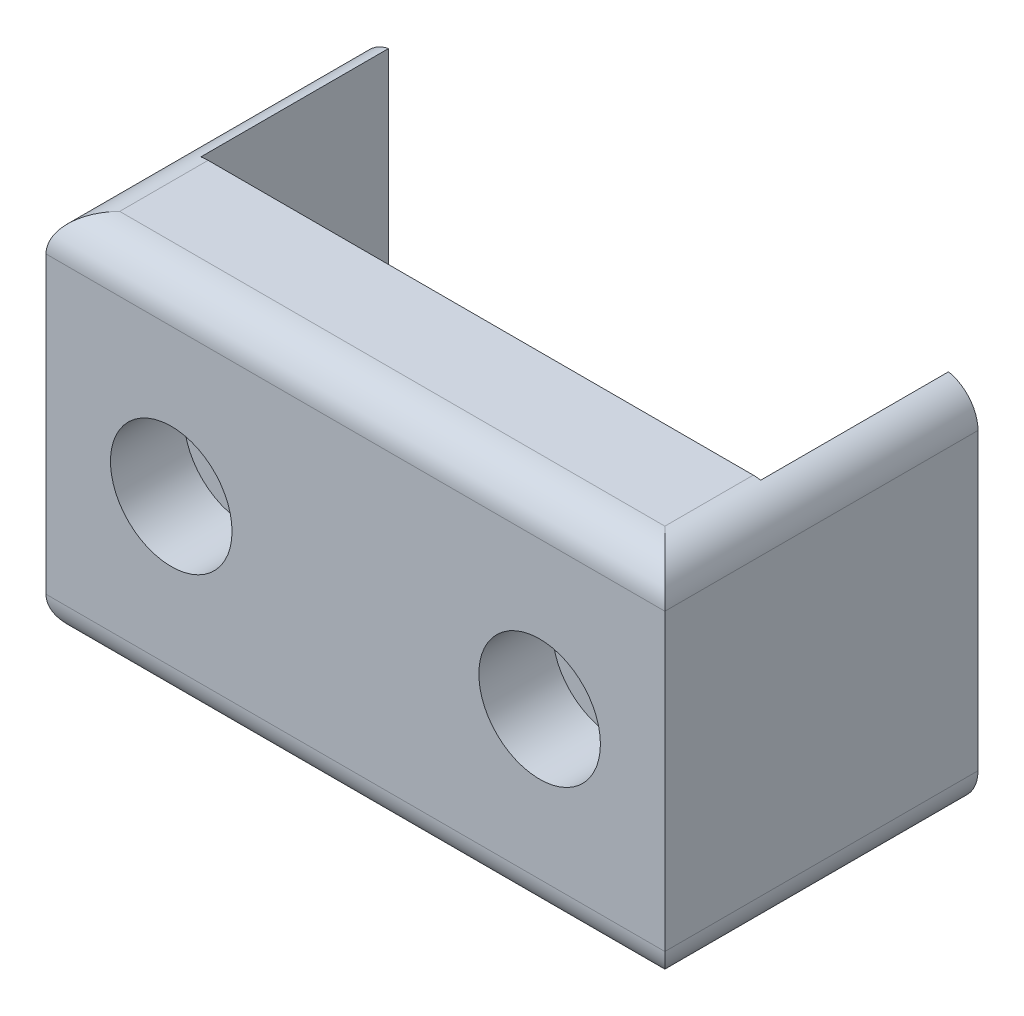
ISO-10303-21;
HEADER;
FILE_DESCRIPTION(('STEP AP214'),'2;1');
FILE_NAME('part.step','',(''),(''),'','','');
FILE_SCHEMA(('AUTOMOTIVE_DESIGN { 1 0 10303 214 1 1 1 1 }'));
ENDSEC;
DATA;
#1=APPLICATION_CONTEXT('core data for automotive mechanical design processes');
#2=APPLICATION_PROTOCOL_DEFINITION('international standard','automotive_design',2000,#1);
#3=PRODUCT_CONTEXT('',#1,'mechanical');
#4=PRODUCT('Part','Part','',(#3));
#5=PRODUCT_RELATED_PRODUCT_CATEGORY('part','',(#4));
#6=PRODUCT_DEFINITION_FORMATION('','',#4);
#7=PRODUCT_DEFINITION_CONTEXT('part definition',#1,'design');
#8=PRODUCT_DEFINITION('design','',#6,#7);
#9=PRODUCT_DEFINITION_SHAPE('','',#8);
#10=(LENGTH_UNIT() NAMED_UNIT(*) SI_UNIT(.MILLI.,.METRE.));
#11=(NAMED_UNIT(*) PLANE_ANGLE_UNIT() SI_UNIT($,.RADIAN.));
#12=(NAMED_UNIT(*) SI_UNIT($,.STERADIAN.) SOLID_ANGLE_UNIT());
#13=UNCERTAINTY_MEASURE_WITH_UNIT(LENGTH_MEASURE(1.E-05),#10,'distance_accuracy_value','');
#14=(GEOMETRIC_REPRESENTATION_CONTEXT(3) GLOBAL_UNCERTAINTY_ASSIGNED_CONTEXT((#13)) GLOBAL_UNIT_ASSIGNED_CONTEXT((#10,
#11,#12)) REPRESENTATION_CONTEXT('',''));
#15=CARTESIAN_POINT('',(0.,0.,0.));
#16=DIRECTION('',(0.,0.,1.));
#17=DIRECTION('',(1.,0.,0.));
#18=AXIS2_PLACEMENT_3D('',#15,#16,#17);
#19=CARTESIAN_POINT('',(12.7,12.7,0.));
#20=DIRECTION('',(0.,0.,1.));
#21=DIRECTION('',(1.,0.,0.));
#22=AXIS2_PLACEMENT_3D('',#19,#20,#21);
#23=CYLINDRICAL_SURFACE('',#22,2.54);
#24=CARTESIAN_POINT('',(12.7,12.7,12.954));
#25=DIRECTION('',(0.,0.,-1.));
#26=DIRECTION('',(-1.,0.,0.));
#27=AXIS2_PLACEMENT_3D('',#24,#25,#26);
#28=CIRCLE('',#27,2.54);
#29=CARTESIAN_POINT('',(10.16,12.7,12.954));
#30=VERTEX_POINT('',#29);
#31=EDGE_CURVE('E242',#30,#30,#28,.T.);
#32=ORIENTED_EDGE('',*,*,#31,.T.);
#33=EDGE_LOOP('',(#32));
#34=FACE_BOUND('',#33,.T.);
#35=CARTESIAN_POINT('',(12.7,12.7,16.51));
#36=DIRECTION('',(0.,0.,1.));
#37=DIRECTION('',(1.,0.,0.));
#38=AXIS2_PLACEMENT_3D('',#35,#36,#37);
#39=CIRCLE('',#38,2.54);
#40=CARTESIAN_POINT('',(15.24,12.7,16.51));
#41=VERTEX_POINT('',#40);
#42=EDGE_CURVE('E239',#41,#41,#39,.F.);
#43=ORIENTED_EDGE('',*,*,#42,.F.);
#44=EDGE_LOOP('',(#43));
#45=FACE_BOUND('',#44,.T.);
#46=ADVANCED_FACE('F39',(#34,#45),#23,.F.);
#47=CARTESIAN_POINT('',(-12.7,12.7,0.));
#48=DIRECTION('',(0.,0.,1.));
#49=DIRECTION('',(1.,0.,0.));
#50=AXIS2_PLACEMENT_3D('',#47,#48,#49);
#51=CYLINDRICAL_SURFACE('',#50,2.54);
#52=CARTESIAN_POINT('',(-12.7,12.7,12.954));
#53=DIRECTION('',(0.,0.,-1.));
#54=DIRECTION('',(-1.,0.,0.));
#55=AXIS2_PLACEMENT_3D('',#52,#53,#54);
#56=CIRCLE('',#55,2.54);
#57=CARTESIAN_POINT('',(-15.24,12.7,12.954));
#58=VERTEX_POINT('',#57);
#59=EDGE_CURVE('E273',#58,#58,#56,.T.);
#60=ORIENTED_EDGE('',*,*,#59,.T.);
#61=EDGE_LOOP('',(#60));
#62=FACE_BOUND('',#61,.T.);
#63=CARTESIAN_POINT('',(-12.7,12.7,16.51));
#64=DIRECTION('',(0.,0.,1.));
#65=DIRECTION('',(1.,0.,0.));
#66=AXIS2_PLACEMENT_3D('',#63,#64,#65);
#67=CIRCLE('',#66,2.54);
#68=CARTESIAN_POINT('',(-10.16,12.7,16.51));
#69=VERTEX_POINT('',#68);
#70=EDGE_CURVE('E236',#69,#69,#67,.F.);
#71=ORIENTED_EDGE('',*,*,#70,.F.);
#72=EDGE_LOOP('',(#71));
#73=FACE_BOUND('',#72,.T.);
#74=ADVANCED_FACE('F318',(#62,#73),#51,.F.);
#75=CARTESIAN_POINT('',(21.336,25.4,0.));
#76=DIRECTION('',(1.,0.,0.));
#77=DIRECTION('',(0.,0.,-1.));
#78=AXIS2_PLACEMENT_3D('',#75,#76,#77);
#79=PLANE('',#78);
#80=DIRECTION('',(0.,-1.,0.));
#81=VECTOR('',#80,1.);
#82=CARTESIAN_POINT('',(21.336,25.4,21.59));
#83=LINE('',#82,#81);
#84=CARTESIAN_POINT('',(21.336,22.86,21.59));
#85=VERTEX_POINT('',#84);
#86=CARTESIAN_POINT('',(21.336,2.54,21.59));
#87=VERTEX_POINT('',#86);
#88=EDGE_CURVE('E152',#85,#87,#83,.T.);
#89=ORIENTED_EDGE('',*,*,#88,.T.);
#90=DIRECTION('',(0.,0.,1.));
#91=VECTOR('',#90,1.);
#92=CARTESIAN_POINT('',(21.336,2.54,0.));
#93=LINE('',#92,#91);
#94=CARTESIAN_POINT('',(21.336,2.54,0.));
#95=VERTEX_POINT('',#94);
#96=EDGE_CURVE('E63',#87,#95,#93,.F.);
#97=ORIENTED_EDGE('',*,*,#96,.T.);
#98=DIRECTION('',(0.,-1.,0.));
#99=VECTOR('',#98,1.);
#100=CARTESIAN_POINT('',(21.336,25.4,0.));
#101=LINE('',#100,#99);
#102=CARTESIAN_POINT('',(21.336,22.86,0.));
#103=VERTEX_POINT('',#102);
#104=EDGE_CURVE('E229',#103,#95,#101,.T.);
#105=ORIENTED_EDGE('',*,*,#104,.F.);
#106=DIRECTION('',(0.,0.,1.));
#107=VECTOR('',#106,1.);
#108=CARTESIAN_POINT('',(21.336,22.86,0.));
#109=LINE('',#108,#107);
#110=EDGE_CURVE('E143',#103,#85,#109,.T.);
#111=ORIENTED_EDGE('',*,*,#110,.T.);
#112=EDGE_LOOP('',(#89,#97,#105,#111));
#113=FACE_BOUND('',#112,.T.);
#114=ADVANCED_FACE('F324',(#113),#79,.T.);
#115=CARTESIAN_POINT('',(0.,25.4,0.));
#116=DIRECTION('',(0.,0.,-1.));
#117=DIRECTION('',(-1.,0.,0.));
#118=AXIS2_PLACEMENT_3D('',#115,#116,#117);
#119=PLANE('',#118);
#120=ORIENTED_EDGE('',*,*,#104,.T.);
#121=CARTESIAN_POINT('',(18.796,2.54,0.));
#122=DIRECTION('',(0.,0.,-1.));
#123=DIRECTION('',(-1.,0.,0.));
#124=AXIS2_PLACEMENT_3D('',#121,#122,#123);
#125=CIRCLE('',#124,2.54);
#126=CARTESIAN_POINT('',(19.304,0.0513184213322936,0.));
#127=VERTEX_POINT('',#126);
#128=EDGE_CURVE('E48',#95,#127,#125,.T.);
#129=ORIENTED_EDGE('',*,*,#128,.T.);
#130=DIRECTION('',(0.,-1.,0.));
#131=VECTOR('',#130,1.);
#132=CARTESIAN_POINT('',(19.304,25.4,0.));
#133=LINE('',#132,#131);
#134=CARTESIAN_POINT('',(19.304,25.3486815786677,0.));
#135=VERTEX_POINT('',#134);
#136=EDGE_CURVE('E226',#135,#127,#133,.T.);
#137=ORIENTED_EDGE('',*,*,#136,.F.);
#138=CARTESIAN_POINT('',(18.796,22.86,0.));
#139=DIRECTION('',(0.,0.,-1.));
#140=DIRECTION('',(-1.,0.,0.));
#141=AXIS2_PLACEMENT_3D('',#138,#139,#140);
#142=CIRCLE('',#141,2.54);
#143=EDGE_CURVE('E176',#135,#103,#142,.T.);
#144=ORIENTED_EDGE('',*,*,#143,.T.);
#145=EDGE_LOOP('',(#120,#129,#137,#144));
#146=FACE_BOUND('',#145,.T.);
#147=ADVANCED_FACE('F339',(#146),#119,.T.);
#148=CARTESIAN_POINT('',(19.304,25.4,0.));
#149=DIRECTION('',(1.,0.,0.));
#150=DIRECTION('',(0.,0.,-1.));
#151=AXIS2_PLACEMENT_3D('',#148,#149,#150);
#152=PLANE('',#151);
#153=ORIENTED_EDGE('',*,*,#136,.T.);
#154=DIRECTION('',(0.,0.,-1.));
#155=VECTOR('',#154,1.);
#156=CARTESIAN_POINT('',(19.304,0.0513184213322923,0.));
#157=LINE('',#156,#155);
#158=CARTESIAN_POINT('',(19.304,0.0513184213322918,12.954));
#159=VERTEX_POINT('',#158);
#160=EDGE_CURVE('E11',#127,#159,#157,.F.);
#161=ORIENTED_EDGE('',*,*,#160,.T.);
#162=DIRECTION('',(0.,-1.,0.));
#163=VECTOR('',#162,1.);
#164=CARTESIAN_POINT('',(19.304,25.4,12.954));
#165=LINE('',#164,#163);
#166=CARTESIAN_POINT('',(19.304,25.3486815786677,12.954));
#167=VERTEX_POINT('',#166);
#168=EDGE_CURVE('E224',#167,#159,#165,.T.);
#169=ORIENTED_EDGE('',*,*,#168,.F.);
#170=DIRECTION('',(0.,0.,1.));
#171=VECTOR('',#170,1.);
#172=CARTESIAN_POINT('',(19.304,25.3486815786677,12.954));
#173=LINE('',#172,#171);
#174=EDGE_CURVE('E174',#167,#135,#173,.F.);
#175=ORIENTED_EDGE('',*,*,#174,.T.);
#176=EDGE_LOOP('',(#153,#161,#169,#175));
#177=FACE_BOUND('',#176,.T.);
#178=ADVANCED_FACE('F223',(#177),#152,.F.);
#179=CARTESIAN_POINT('',(0.,25.4,12.954));
#180=DIRECTION('',(0.,0.,-1.));
#181=DIRECTION('',(-1.,0.,0.));
#182=AXIS2_PLACEMENT_3D('',#179,#180,#181);
#183=PLANE('',#182);
#184=ORIENTED_EDGE('',*,*,#59,.F.);
#185=EDGE_LOOP('',(#184));
#186=FACE_BOUND('',#185,.T.);
#187=ORIENTED_EDGE('',*,*,#31,.F.);
#188=EDGE_LOOP('',(#187));
#189=FACE_BOUND('',#188,.T.);
#190=DIRECTION('',(1.,0.,0.));
#191=VECTOR('',#190,1.);
#192=CARTESIAN_POINT('',(0.,0.,12.954));
#193=LINE('',#192,#191);
#194=CARTESIAN_POINT('',(-18.796,0.,12.954));
#195=VERTEX_POINT('',#194);
#196=CARTESIAN_POINT('',(18.796,0.,12.954));
#197=VERTEX_POINT('',#196);
#198=EDGE_CURVE('E153',#195,#197,#193,.T.);
#199=ORIENTED_EDGE('',*,*,#198,.F.);
#200=CARTESIAN_POINT('',(-18.796,2.54,12.954));
#201=DIRECTION('',(0.,0.,-1.));
#202=DIRECTION('',(-1.,0.,0.));
#203=AXIS2_PLACEMENT_3D('',#200,#201,#202);
#204=CIRCLE('',#203,2.54);
#205=CARTESIAN_POINT('',(-19.304,0.0513184213322901,12.954));
#206=VERTEX_POINT('',#205);
#207=EDGE_CURVE('E196',#195,#206,#204,.T.);
#208=ORIENTED_EDGE('',*,*,#207,.T.);
#209=DIRECTION('',(0.,-1.,0.));
#210=VECTOR('',#209,1.);
#211=CARTESIAN_POINT('',(-19.304,25.4,12.954));
#212=LINE('',#211,#210);
#213=CARTESIAN_POINT('',(-19.304,25.3486815786677,12.954));
#214=VERTEX_POINT('',#213);
#215=EDGE_CURVE('E139',#214,#206,#212,.T.);
#216=ORIENTED_EDGE('',*,*,#215,.F.);
#217=CARTESIAN_POINT('',(-18.796,22.86,12.954));
#218=DIRECTION('',(0.,0.,-1.));
#219=DIRECTION('',(-1.,0.,0.));
#220=AXIS2_PLACEMENT_3D('',#217,#218,#219);
#221=CIRCLE('',#220,2.54);
#222=CARTESIAN_POINT('',(-18.796,25.4,12.954));
#223=VERTEX_POINT('',#222);
#224=EDGE_CURVE('E132',#214,#223,#221,.T.);
#225=ORIENTED_EDGE('',*,*,#224,.T.);
#226=DIRECTION('',(1.,0.,0.));
#227=VECTOR('',#226,1.);
#228=CARTESIAN_POINT('',(0.,25.4,12.954));
#229=LINE('',#228,#227);
#230=CARTESIAN_POINT('',(18.796,25.4,12.954));
#231=VERTEX_POINT('',#230);
#232=EDGE_CURVE('E136',#223,#231,#229,.T.);
#233=ORIENTED_EDGE('',*,*,#232,.T.);
#234=CARTESIAN_POINT('',(18.796,22.86,12.954));
#235=DIRECTION('',(0.,0.,-1.));
#236=DIRECTION('',(-1.,0.,0.));
#237=AXIS2_PLACEMENT_3D('',#234,#235,#236);
#238=CIRCLE('',#237,2.54);
#239=EDGE_CURVE('E144',#231,#167,#238,.T.);
#240=ORIENTED_EDGE('',*,*,#239,.T.);
#241=ORIENTED_EDGE('',*,*,#168,.T.);
#242=CARTESIAN_POINT('',(18.796,2.54,12.954));
#243=DIRECTION('',(0.,0.,-1.));
#244=DIRECTION('',(-1.,0.,0.));
#245=AXIS2_PLACEMENT_3D('',#242,#243,#244);
#246=CIRCLE('',#245,2.54);
#247=EDGE_CURVE('E194',#159,#197,#246,.T.);
#248=ORIENTED_EDGE('',*,*,#247,.T.);
#249=EDGE_LOOP('',(#199,#208,#216,#225,#233,#240,#241,#248));
#250=FACE_BOUND('',#249,.T.);
#251=ADVANCED_FACE('F135',(#186,#189,#250),#183,.T.);
#252=CARTESIAN_POINT('',(-19.304,25.4,0.));
#253=DIRECTION('',(1.,0.,0.));
#254=DIRECTION('',(0.,0.,-1.));
#255=AXIS2_PLACEMENT_3D('',#252,#253,#254);
#256=PLANE('',#255);
#257=ORIENTED_EDGE('',*,*,#215,.T.);
#258=DIRECTION('',(0.,0.,1.));
#259=VECTOR('',#258,1.);
#260=CARTESIAN_POINT('',(-19.304,0.0513184213322905,12.954));
#261=LINE('',#260,#259);
#262=CARTESIAN_POINT('',(-19.304,0.051318421332291,0.));
#263=VERTEX_POINT('',#262);
#264=EDGE_CURVE('E198',#206,#263,#261,.F.);
#265=ORIENTED_EDGE('',*,*,#264,.T.);
#266=DIRECTION('',(0.,-1.,0.));
#267=VECTOR('',#266,1.);
#268=CARTESIAN_POINT('',(-19.304,25.4,0.));
#269=LINE('',#268,#267);
#270=CARTESIAN_POINT('',(-19.304,25.3486815786677,0.));
#271=VERTEX_POINT('',#270);
#272=EDGE_CURVE('E231',#271,#263,#269,.T.);
#273=ORIENTED_EDGE('',*,*,#272,.F.);
#274=DIRECTION('',(0.,0.,-1.));
#275=VECTOR('',#274,1.);
#276=CARTESIAN_POINT('',(-19.304,25.3486815786677,0.));
#277=LINE('',#276,#275);
#278=EDGE_CURVE('E170',#271,#214,#277,.F.);
#279=ORIENTED_EDGE('',*,*,#278,.T.);
#280=EDGE_LOOP('',(#257,#265,#273,#279));
#281=FACE_BOUND('',#280,.T.);
#282=ADVANCED_FACE('F268',(#281),#256,.T.);
#283=ORIENTED_EDGE('',*,*,#272,.T.);
#284=CARTESIAN_POINT('',(-18.796,2.54,0.));
#285=DIRECTION('',(0.,0.,-1.));
#286=DIRECTION('',(-1.,0.,0.));
#287=AXIS2_PLACEMENT_3D('',#284,#285,#286);
#288=CIRCLE('',#287,2.54);
#289=CARTESIAN_POINT('',(-21.336,2.54,0.));
#290=VERTEX_POINT('',#289);
#291=EDGE_CURVE('E200',#263,#290,#288,.T.);
#292=ORIENTED_EDGE('',*,*,#291,.T.);
#293=DIRECTION('',(0.,-1.,0.));
#294=VECTOR('',#293,1.);
#295=CARTESIAN_POINT('',(-21.336,25.4,0.));
#296=LINE('',#295,#294);
#297=CARTESIAN_POINT('',(-21.336,22.86,0.));
#298=VERTEX_POINT('',#297);
#299=EDGE_CURVE('E260',#298,#290,#296,.T.);
#300=ORIENTED_EDGE('',*,*,#299,.F.);
#301=CARTESIAN_POINT('',(-18.796,22.86,0.));
#302=DIRECTION('',(0.,0.,-1.));
#303=DIRECTION('',(-1.,0.,0.));
#304=AXIS2_PLACEMENT_3D('',#301,#302,#303);
#305=CIRCLE('',#304,2.54);
#306=EDGE_CURVE('E163',#298,#271,#305,.T.);
#307=ORIENTED_EDGE('',*,*,#306,.T.);
#308=EDGE_LOOP('',(#283,#292,#300,#307));
#309=FACE_BOUND('',#308,.T.);
#310=ADVANCED_FACE('F265',(#309),#119,.T.);
#311=CARTESIAN_POINT('',(-21.336,25.4,0.));
#312=DIRECTION('',(1.,0.,0.));
#313=DIRECTION('',(0.,0.,-1.));
#314=AXIS2_PLACEMENT_3D('',#311,#312,#313);
#315=PLANE('',#314);
#316=ORIENTED_EDGE('',*,*,#299,.T.);
#317=DIRECTION('',(0.,0.,1.));
#318=VECTOR('',#317,1.);
#319=CARTESIAN_POINT('',(-21.336,2.54,0.));
#320=LINE('',#319,#318);
#321=CARTESIAN_POINT('',(-21.336,2.54,21.59));
#322=VERTEX_POINT('',#321);
#323=EDGE_CURVE('E180',#290,#322,#320,.T.);
#324=ORIENTED_EDGE('',*,*,#323,.T.);
#325=DIRECTION('',(0.,-1.,0.));
#326=VECTOR('',#325,1.);
#327=CARTESIAN_POINT('',(-21.336,25.4,21.59));
#328=LINE('',#327,#326);
#329=CARTESIAN_POINT('',(-21.336,22.86,21.59));
#330=VERTEX_POINT('',#329);
#331=EDGE_CURVE('E255',#330,#322,#328,.T.);
#332=ORIENTED_EDGE('',*,*,#331,.F.);
#333=DIRECTION('',(0.,0.,1.));
#334=VECTOR('',#333,1.);
#335=CARTESIAN_POINT('',(-21.336,22.86,0.));
#336=LINE('',#335,#334);
#337=EDGE_CURVE('E161',#330,#298,#336,.F.);
#338=ORIENTED_EDGE('',*,*,#337,.T.);
#339=EDGE_LOOP('',(#316,#324,#332,#338));
#340=FACE_BOUND('',#339,.T.);
#341=ADVANCED_FACE('F258',(#340),#315,.F.);
#342=CARTESIAN_POINT('',(0.,25.4,21.59));
#343=DIRECTION('',(0.,0.,-1.));
#344=DIRECTION('',(-1.,0.,0.));
#345=AXIS2_PLACEMENT_3D('',#342,#343,#344);
#346=PLANE('',#345);
#347=CARTESIAN_POINT('',(-12.7,12.7,21.59));
#348=DIRECTION('',(0.,0.,1.));
#349=DIRECTION('',(1.,0.,0.));
#350=AXIS2_PLACEMENT_3D('',#347,#348,#349);
#351=CIRCLE('',#350,4.191);
#352=CARTESIAN_POINT('',(-8.509,12.7,21.59));
#353=VERTEX_POINT('',#352);
#354=EDGE_CURVE('E284',#353,#353,#351,.T.);
#355=ORIENTED_EDGE('',*,*,#354,.F.);
#356=EDGE_LOOP('',(#355));
#357=FACE_BOUND('',#356,.T.);
#358=CARTESIAN_POINT('',(12.7,12.7,21.59));
#359=DIRECTION('',(0.,0.,1.));
#360=DIRECTION('',(1.,0.,0.));
#361=AXIS2_PLACEMENT_3D('',#358,#359,#360);
#362=CIRCLE('',#361,4.191);
#363=CARTESIAN_POINT('',(16.891,12.7,21.59));
#364=VERTEX_POINT('',#363);
#365=EDGE_CURVE('E281',#364,#364,#362,.T.);
#366=ORIENTED_EDGE('',*,*,#365,.F.);
#367=EDGE_LOOP('',(#366));
#368=FACE_BOUND('',#367,.T.);
#369=ORIENTED_EDGE('',*,*,#331,.T.);
#370=DIRECTION('',(1.,0.,0.));
#371=VECTOR('',#370,1.);
#372=CARTESIAN_POINT('',(0.,2.54,21.59));
#373=LINE('',#372,#371);
#374=EDGE_CURVE('E202',#322,#87,#373,.T.);
#375=ORIENTED_EDGE('',*,*,#374,.T.);
#376=ORIENTED_EDGE('',*,*,#88,.F.);
#377=DIRECTION('',(1.,0.,0.));
#378=VECTOR('',#377,1.);
#379=CARTESIAN_POINT('',(-21.336,22.86,21.59));
#380=LINE('',#379,#378);
#381=EDGE_CURVE('E178',#85,#330,#380,.F.);
#382=ORIENTED_EDGE('',*,*,#381,.T.);
#383=EDGE_LOOP('',(#369,#375,#376,#382));
#384=FACE_BOUND('',#383,.T.);
#385=ADVANCED_FACE('F254',(#357,#368,#384),#346,.F.);
#386=CARTESIAN_POINT('',(0.,25.4,0.));
#387=DIRECTION('',(0.,1.,0.));
#388=DIRECTION('',(0.,0.,1.));
#389=AXIS2_PLACEMENT_3D('',#386,#387,#388);
#390=PLANE('',#389);
#391=ORIENTED_EDGE('',*,*,#232,.F.);
#392=DIRECTION('',(0.,0.,1.));
#393=VECTOR('',#392,1.);
#394=CARTESIAN_POINT('',(-18.796,25.4,21.59));
#395=LINE('',#394,#393);
#396=CARTESIAN_POINT('',(-18.796,25.4,19.05));
#397=VERTEX_POINT('',#396);
#398=EDGE_CURVE('E149',#223,#397,#395,.T.);
#399=ORIENTED_EDGE('',*,*,#398,.T.);
#400=DIRECTION('',(1.,0.,0.));
#401=VECTOR('',#400,1.);
#402=CARTESIAN_POINT('',(21.336,25.4,19.05));
#403=LINE('',#402,#401);
#404=CARTESIAN_POINT('',(18.796,25.4,19.05));
#405=VERTEX_POINT('',#404);
#406=EDGE_CURVE('E165',#397,#405,#403,.T.);
#407=ORIENTED_EDGE('',*,*,#406,.T.);
#408=DIRECTION('',(0.,0.,1.));
#409=VECTOR('',#408,1.);
#410=CARTESIAN_POINT('',(18.796,25.4,0.));
#411=LINE('',#410,#409);
#412=EDGE_CURVE('E151',#405,#231,#411,.F.);
#413=ORIENTED_EDGE('',*,*,#412,.T.);
#414=EDGE_LOOP('',(#391,#399,#407,#413));
#415=FACE_BOUND('',#414,.T.);
#416=ADVANCED_FACE('F148',(#415),#390,.T.);
#417=CARTESIAN_POINT('',(0.,0.,0.));
#418=DIRECTION('',(0.,1.,0.));
#419=DIRECTION('',(0.,0.,1.));
#420=AXIS2_PLACEMENT_3D('',#417,#418,#419);
#421=PLANE('',#420);
#422=DIRECTION('',(1.,0.,0.));
#423=VECTOR('',#422,1.);
#424=CARTESIAN_POINT('',(0.,0.,19.05));
#425=LINE('',#424,#423);
#426=CARTESIAN_POINT('',(18.796,0.,19.05));
#427=VERTEX_POINT('',#426);
#428=CARTESIAN_POINT('',(-18.796,0.,19.05));
#429=VERTEX_POINT('',#428);
#430=EDGE_CURVE('E190',#427,#429,#425,.F.);
#431=ORIENTED_EDGE('',*,*,#430,.T.);
#432=DIRECTION('',(0.,0.,1.));
#433=VECTOR('',#432,1.);
#434=CARTESIAN_POINT('',(-18.796,0.,0.));
#435=LINE('',#434,#433);
#436=EDGE_CURVE('E192',#429,#195,#435,.F.);
#437=ORIENTED_EDGE('',*,*,#436,.T.);
#438=ORIENTED_EDGE('',*,*,#198,.T.);
#439=DIRECTION('',(0.,0.,1.));
#440=VECTOR('',#439,1.);
#441=CARTESIAN_POINT('',(18.796,0.,21.59));
#442=LINE('',#441,#440);
#443=EDGE_CURVE('E188',#197,#427,#442,.T.);
#444=ORIENTED_EDGE('',*,*,#443,.T.);
#445=EDGE_LOOP('',(#431,#437,#438,#444));
#446=FACE_BOUND('',#445,.T.);
#447=ADVANCED_FACE('F331',(#446),#421,.F.);
#448=CARTESIAN_POINT('',(-12.7,12.7,16.51));
#449=DIRECTION('',(0.,0.,1.));
#450=DIRECTION('',(1.,0.,0.));
#451=AXIS2_PLACEMENT_3D('',#448,#449,#450);
#452=PLANE('',#451);
#453=CARTESIAN_POINT('',(-12.7,12.7,16.51));
#454=DIRECTION('',(0.,0.,1.));
#455=DIRECTION('',(1.,0.,0.));
#456=AXIS2_PLACEMENT_3D('',#453,#454,#455);
#457=CIRCLE('',#456,4.191);
#458=CARTESIAN_POINT('',(-8.509,12.7,16.51));
#459=VERTEX_POINT('',#458);
#460=EDGE_CURVE('E240',#459,#459,#457,.T.);
#461=ORIENTED_EDGE('',*,*,#460,.T.);
#462=EDGE_LOOP('',(#461));
#463=FACE_BOUND('',#462,.T.);
#464=ORIENTED_EDGE('',*,*,#70,.T.);
#465=EDGE_LOOP('',(#464));
#466=FACE_BOUND('',#465,.T.);
#467=ADVANCED_FACE('F290',(#463,#466),#452,.T.);
#468=CARTESIAN_POINT('',(-12.7,12.7,16.51));
#469=DIRECTION('',(0.,0.,1.));
#470=DIRECTION('',(1.,0.,0.));
#471=AXIS2_PLACEMENT_3D('',#468,#469,#470);
#472=CYLINDRICAL_SURFACE('',#471,4.191);
#473=ORIENTED_EDGE('',*,*,#460,.F.);
#474=EDGE_LOOP('',(#473));
#475=FACE_BOUND('',#474,.T.);
#476=ORIENTED_EDGE('',*,*,#354,.T.);
#477=EDGE_LOOP('',(#476));
#478=FACE_BOUND('',#477,.T.);
#479=ADVANCED_FACE('F293',(#475,#478),#472,.F.);
#480=CARTESIAN_POINT('',(12.7,12.7,16.51));
#481=DIRECTION('',(0.,0.,1.));
#482=DIRECTION('',(1.,0.,0.));
#483=AXIS2_PLACEMENT_3D('',#480,#481,#482);
#484=PLANE('',#483);
#485=CARTESIAN_POINT('',(12.7,12.7,16.51));
#486=DIRECTION('',(0.,0.,1.));
#487=DIRECTION('',(1.,0.,0.));
#488=AXIS2_PLACEMENT_3D('',#485,#486,#487);
#489=CIRCLE('',#488,4.191);
#490=CARTESIAN_POINT('',(16.891,12.7,16.51));
#491=VERTEX_POINT('',#490);
#492=EDGE_CURVE('E185',#491,#491,#489,.T.);
#493=ORIENTED_EDGE('',*,*,#492,.T.);
#494=EDGE_LOOP('',(#493));
#495=FACE_BOUND('',#494,.T.);
#496=ORIENTED_EDGE('',*,*,#42,.T.);
#497=EDGE_LOOP('',(#496));
#498=FACE_BOUND('',#497,.T.);
#499=ADVANCED_FACE('F296',(#495,#498),#484,.T.);
#500=CARTESIAN_POINT('',(12.7,12.7,16.51));
#501=DIRECTION('',(0.,0.,1.));
#502=DIRECTION('',(1.,0.,0.));
#503=AXIS2_PLACEMENT_3D('',#500,#501,#502);
#504=CYLINDRICAL_SURFACE('',#503,4.191);
#505=ORIENTED_EDGE('',*,*,#492,.F.);
#506=EDGE_LOOP('',(#505));
#507=FACE_BOUND('',#506,.T.);
#508=ORIENTED_EDGE('',*,*,#365,.T.);
#509=EDGE_LOOP('',(#508));
#510=FACE_BOUND('',#509,.T.);
#511=ADVANCED_FACE('F305',(#507,#510),#504,.F.);
#512=CARTESIAN_POINT('',(18.796,22.86,0.));
#513=DIRECTION('',(0.,0.,1.));
#514=DIRECTION('',(1.,0.,0.));
#515=AXIS2_PLACEMENT_3D('',#512,#513,#514);
#516=CYLINDRICAL_SURFACE('',#515,2.54);
#517=ORIENTED_EDGE('',*,*,#239,.F.);
#518=ORIENTED_EDGE('',*,*,#412,.F.);
#519=CARTESIAN_POINT('',(18.796,22.86,19.05));
#520=DIRECTION('',(-0.707106781186547,0.,0.707106781186547));
#521=DIRECTION('',(-0.707106781186547,0.,-0.707106781186547));
#522=AXIS2_PLACEMENT_3D('',#519,#520,#521);
#523=ELLIPSE('',#522,3.59210244842766,2.54);
#524=EDGE_CURVE('E182',#85,#405,#523,.T.);
#525=ORIENTED_EDGE('',*,*,#524,.F.);
#526=ORIENTED_EDGE('',*,*,#110,.F.);
#527=ORIENTED_EDGE('',*,*,#143,.F.);
#528=ORIENTED_EDGE('',*,*,#174,.F.);
#529=EDGE_LOOP('',(#517,#518,#525,#526,#527,#528));
#530=FACE_BOUND('',#529,.T.);
#531=ADVANCED_FACE('F246',(#530),#516,.T.);
#532=CARTESIAN_POINT('',(0.,22.86,19.05));
#533=DIRECTION('',(-1.,0.,0.));
#534=DIRECTION('',(0.,0.,1.));
#535=AXIS2_PLACEMENT_3D('',#532,#533,#534);
#536=CYLINDRICAL_SURFACE('',#535,2.54);
#537=ORIENTED_EDGE('',*,*,#524,.T.);
#538=ORIENTED_EDGE('',*,*,#406,.F.);
#539=CARTESIAN_POINT('',(-18.796,22.86,19.05));
#540=DIRECTION('',(-0.707106781186547,0.,-0.707106781186547));
#541=DIRECTION('',(-0.707106781186547,0.,0.707106781186547));
#542=AXIS2_PLACEMENT_3D('',#539,#540,#541);
#543=ELLIPSE('',#542,3.59210244842766,2.54);
#544=EDGE_CURVE('E159',#330,#397,#543,.T.);
#545=ORIENTED_EDGE('',*,*,#544,.F.);
#546=ORIENTED_EDGE('',*,*,#381,.F.);
#547=EDGE_LOOP('',(#537,#538,#545,#546));
#548=FACE_BOUND('',#547,.T.);
#549=ADVANCED_FACE('F249',(#548),#536,.T.);
#550=CARTESIAN_POINT('',(-18.796,22.86,0.));
#551=DIRECTION('',(0.,0.,-1.));
#552=DIRECTION('',(-1.,0.,0.));
#553=AXIS2_PLACEMENT_3D('',#550,#551,#552);
#554=CYLINDRICAL_SURFACE('',#553,2.54);
#555=ORIENTED_EDGE('',*,*,#306,.F.);
#556=ORIENTED_EDGE('',*,*,#337,.F.);
#557=ORIENTED_EDGE('',*,*,#544,.T.);
#558=ORIENTED_EDGE('',*,*,#398,.F.);
#559=ORIENTED_EDGE('',*,*,#224,.F.);
#560=ORIENTED_EDGE('',*,*,#278,.F.);
#561=EDGE_LOOP('',(#555,#556,#557,#558,#559,#560));
#562=FACE_BOUND('',#561,.T.);
#563=ADVANCED_FACE('F156',(#562),#554,.T.);
#564=CARTESIAN_POINT('',(18.796,2.54,0.));
#565=DIRECTION('',(0.,0.,-1.));
#566=DIRECTION('',(-1.,0.,0.));
#567=AXIS2_PLACEMENT_3D('',#564,#565,#566);
#568=CYLINDRICAL_SURFACE('',#567,2.54);
#569=ORIENTED_EDGE('',*,*,#128,.F.);
#570=ORIENTED_EDGE('',*,*,#96,.F.);
#571=CARTESIAN_POINT('',(18.796,2.54,19.05));
#572=DIRECTION('',(0.707106781186547,0.,-0.707106781186547));
#573=DIRECTION('',(-0.707106781186547,0.,-0.707106781186547));
#574=AXIS2_PLACEMENT_3D('',#571,#572,#573);
#575=ELLIPSE('',#574,3.59210244842766,2.54);
#576=EDGE_CURVE('E43',#427,#87,#575,.F.);
#577=ORIENTED_EDGE('',*,*,#576,.F.);
#578=ORIENTED_EDGE('',*,*,#443,.F.);
#579=ORIENTED_EDGE('',*,*,#247,.F.);
#580=ORIENTED_EDGE('',*,*,#160,.F.);
#581=EDGE_LOOP('',(#569,#570,#577,#578,#579,#580));
#582=FACE_BOUND('',#581,.T.);
#583=ADVANCED_FACE('F41',(#582),#568,.T.);
#584=CARTESIAN_POINT('',(0.,2.54,19.05));
#585=DIRECTION('',(1.,0.,0.));
#586=DIRECTION('',(0.,0.,-1.));
#587=AXIS2_PLACEMENT_3D('',#584,#585,#586);
#588=CYLINDRICAL_SURFACE('',#587,2.54);
#589=ORIENTED_EDGE('',*,*,#576,.T.);
#590=ORIENTED_EDGE('',*,*,#374,.F.);
#591=CARTESIAN_POINT('',(-18.796,2.54,19.05));
#592=DIRECTION('',(0.707106781186547,0.,0.707106781186547));
#593=DIRECTION('',(0.707106781186547,0.,-0.707106781186547));
#594=AXIS2_PLACEMENT_3D('',#591,#592,#593);
#595=ELLIPSE('',#594,3.59210244842766,2.54);
#596=EDGE_CURVE('E205',#429,#322,#595,.F.);
#597=ORIENTED_EDGE('',*,*,#596,.F.);
#598=ORIENTED_EDGE('',*,*,#430,.F.);
#599=EDGE_LOOP('',(#589,#590,#597,#598));
#600=FACE_BOUND('',#599,.T.);
#601=ADVANCED_FACE('F215',(#600),#588,.T.);
#602=CARTESIAN_POINT('',(-18.796,2.54,0.));
#603=DIRECTION('',(0.,0.,1.));
#604=DIRECTION('',(1.,0.,0.));
#605=AXIS2_PLACEMENT_3D('',#602,#603,#604);
#606=CYLINDRICAL_SURFACE('',#605,2.54);
#607=ORIENTED_EDGE('',*,*,#207,.F.);
#608=ORIENTED_EDGE('',*,*,#436,.F.);
#609=ORIENTED_EDGE('',*,*,#596,.T.);
#610=ORIENTED_EDGE('',*,*,#323,.F.);
#611=ORIENTED_EDGE('',*,*,#291,.F.);
#612=ORIENTED_EDGE('',*,*,#264,.F.);
#613=EDGE_LOOP('',(#607,#608,#609,#610,#611,#612));
#614=FACE_BOUND('',#613,.T.);
#615=ADVANCED_FACE('F353',(#614),#606,.T.);
#616=CLOSED_SHELL('',(#46,#74,#114,#147,#178,#251,#282,#310,#341,#385,#416,#447,#467,#479,#499,
#511,#531,#549,#563,#583,#601,#615));
#617=MANIFOLD_SOLID_BREP('B2',#616);
#618=ADVANCED_BREP_SHAPE_REPRESENTATION('',(#18,#617),#14);
#619=SHAPE_DEFINITION_REPRESENTATION(#9,#618);
ENDSEC;
END-ISO-10303-21;
